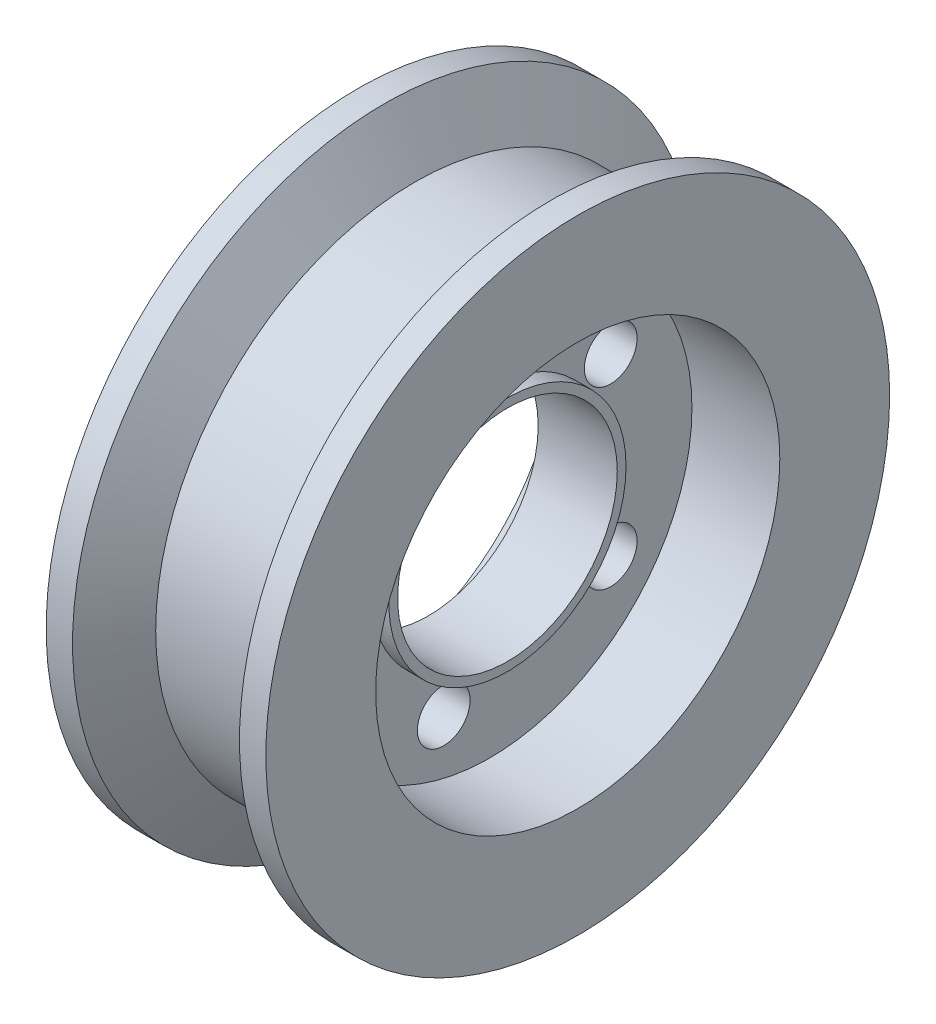
ISO-10303-21;
HEADER;
FILE_DESCRIPTION(('STEP AP214'),'2;1');
FILE_NAME('part.step','',(''),(''),'','','');
FILE_SCHEMA(('AUTOMOTIVE_DESIGN { 1 0 10303 214 1 1 1 1 }'));
ENDSEC;
DATA;
#1=APPLICATION_CONTEXT('core data for automotive mechanical design processes');
#2=APPLICATION_PROTOCOL_DEFINITION('international standard','automotive_design',2000,#1);
#3=PRODUCT_CONTEXT('',#1,'mechanical');
#4=PRODUCT('Part','Part','',(#3));
#5=PRODUCT_RELATED_PRODUCT_CATEGORY('part','',(#4));
#6=PRODUCT_DEFINITION_FORMATION('','',#4);
#7=PRODUCT_DEFINITION_CONTEXT('part definition',#1,'design');
#8=PRODUCT_DEFINITION('design','',#6,#7);
#9=PRODUCT_DEFINITION_SHAPE('','',#8);
#10=(LENGTH_UNIT() NAMED_UNIT(*) SI_UNIT(.MILLI.,.METRE.));
#11=(NAMED_UNIT(*) PLANE_ANGLE_UNIT() SI_UNIT($,.RADIAN.));
#12=(NAMED_UNIT(*) SI_UNIT($,.STERADIAN.) SOLID_ANGLE_UNIT());
#13=UNCERTAINTY_MEASURE_WITH_UNIT(LENGTH_MEASURE(1.E-05),#10,'distance_accuracy_value','');
#14=(GEOMETRIC_REPRESENTATION_CONTEXT(3) GLOBAL_UNCERTAINTY_ASSIGNED_CONTEXT((#13)) GLOBAL_UNIT_ASSIGNED_CONTEXT((#10,
#11,#12)) REPRESENTATION_CONTEXT('',''));
#15=CARTESIAN_POINT('',(0.,0.,0.));
#16=DIRECTION('',(0.,0.,1.));
#17=DIRECTION('',(1.,0.,0.));
#18=AXIS2_PLACEMENT_3D('',#15,#16,#17);
#19=CARTESIAN_POINT('',(12.5,0.,0.));
#20=DIRECTION('',(-1.,0.,0.));
#21=DIRECTION('',(0.,0.,1.));
#22=AXIS2_PLACEMENT_3D('',#19,#20,#21);
#23=CYLINDRICAL_SURFACE('',#22,35.5);
#24=CARTESIAN_POINT('',(-12.5,0.,0.));
#25=DIRECTION('',(1.,0.,0.));
#26=DIRECTION('',(0.,0.,-1.));
#27=AXIS2_PLACEMENT_3D('',#24,#25,#26);
#28=CIRCLE('',#27,35.5);
#29=CARTESIAN_POINT('',(-12.5,0.,-35.5));
#30=VERTEX_POINT('',#29);
#31=EDGE_CURVE('E98',#30,#30,#28,.T.);
#32=ORIENTED_EDGE('',*,*,#31,.T.);
#33=EDGE_LOOP('',(#32));
#34=FACE_BOUND('',#33,.T.);
#35=CARTESIAN_POINT('',(-9.5,0.,0.));
#36=DIRECTION('',(1.,0.,0.));
#37=DIRECTION('',(0.,0.,-1.));
#38=AXIS2_PLACEMENT_3D('',#35,#36,#37);
#39=CIRCLE('',#38,35.5);
#40=CARTESIAN_POINT('',(-9.5,0.,-35.5));
#41=VERTEX_POINT('',#40);
#42=EDGE_CURVE('E164',#41,#41,#39,.T.);
#43=ORIENTED_EDGE('',*,*,#42,.F.);
#44=EDGE_LOOP('',(#43));
#45=FACE_BOUND('',#44,.T.);
#46=ADVANCED_FACE('F43',(#34,#45),#23,.T.);
#47=CARTESIAN_POINT('',(12.5,0.,0.));
#48=DIRECTION('',(1.,0.,0.));
#49=DIRECTION('',(0.,0.,-1.));
#50=AXIS2_PLACEMENT_3D('',#47,#48,#49);
#51=CIRCLE('',#50,35.5);
#52=CARTESIAN_POINT('',(12.5,0.,-35.5));
#53=VERTEX_POINT('',#52);
#54=EDGE_CURVE('E57',#53,#53,#51,.T.);
#55=ORIENTED_EDGE('',*,*,#54,.F.);
#56=EDGE_LOOP('',(#55));
#57=FACE_BOUND('',#56,.T.);
#58=CARTESIAN_POINT('',(9.5,0.,0.));
#59=DIRECTION('',(1.,0.,0.));
#60=DIRECTION('',(0.,0.,-1.));
#61=AXIS2_PLACEMENT_3D('',#58,#59,#60);
#62=CIRCLE('',#61,35.5);
#63=CARTESIAN_POINT('',(9.5,0.,-35.5));
#64=VERTEX_POINT('',#63);
#65=EDGE_CURVE('E242',#64,#64,#62,.T.);
#66=ORIENTED_EDGE('',*,*,#65,.T.);
#67=EDGE_LOOP('',(#66));
#68=FACE_BOUND('',#67,.T.);
#69=ADVANCED_FACE('F161',(#57,#68),#23,.T.);
#70=CARTESIAN_POINT('',(12.5,0.,0.));
#71=DIRECTION('',(1.,0.,0.));
#72=DIRECTION('',(0.,0.,-1.));
#73=AXIS2_PLACEMENT_3D('',#70,#71,#72);
#74=PLANE('',#73);
#75=CARTESIAN_POINT('',(12.5,0.,0.));
#76=DIRECTION('',(1.,0.,0.));
#77=DIRECTION('',(0.,0.,-1.));
#78=AXIS2_PLACEMENT_3D('',#75,#76,#77);
#79=CIRCLE('',#78,23.);
#80=CARTESIAN_POINT('',(12.5,0.,-23.));
#81=VERTEX_POINT('',#80);
#82=EDGE_CURVE('E89',#81,#81,#79,.T.);
#83=ORIENTED_EDGE('',*,*,#82,.F.);
#84=EDGE_LOOP('',(#83));
#85=FACE_BOUND('',#84,.T.);
#86=ORIENTED_EDGE('',*,*,#54,.T.);
#87=EDGE_LOOP('',(#86));
#88=FACE_BOUND('',#87,.T.);
#89=ADVANCED_FACE('F155',(#85,#88),#74,.T.);
#90=CARTESIAN_POINT('',(-12.5,0.,0.));
#91=DIRECTION('',(1.,0.,0.));
#92=DIRECTION('',(0.,0.,-1.));
#93=AXIS2_PLACEMENT_3D('',#90,#91,#92);
#94=PLANE('',#93);
#95=CARTESIAN_POINT('',(-12.5,0.,0.));
#96=DIRECTION('',(1.,0.,0.));
#97=DIRECTION('',(0.,0.,-1.));
#98=AXIS2_PLACEMENT_3D('',#95,#96,#97);
#99=CIRCLE('',#98,23.);
#100=CARTESIAN_POINT('',(-12.5,0.,-23.));
#101=VERTEX_POINT('',#100);
#102=EDGE_CURVE('E90',#101,#101,#99,.T.);
#103=ORIENTED_EDGE('',*,*,#102,.T.);
#104=EDGE_LOOP('',(#103));
#105=FACE_BOUND('',#104,.T.);
#106=ORIENTED_EDGE('',*,*,#31,.F.);
#107=EDGE_LOOP('',(#106));
#108=FACE_BOUND('',#107,.T.);
#109=ADVANCED_FACE('F151',(#105,#108),#94,.F.);
#110=CARTESIAN_POINT('',(2.5,0.,0.));
#111=DIRECTION('',(1.,0.,0.));
#112=DIRECTION('',(0.,0.,-1.));
#113=AXIS2_PLACEMENT_3D('',#110,#111,#112);
#114=CYLINDRICAL_SURFACE('',#113,23.);
#115=CARTESIAN_POINT('',(2.5,0.,0.));
#116=DIRECTION('',(1.,0.,0.));
#117=DIRECTION('',(0.,0.,-1.));
#118=AXIS2_PLACEMENT_3D('',#115,#116,#117);
#119=CIRCLE('',#118,23.);
#120=CARTESIAN_POINT('',(2.5,0.,-23.));
#121=VERTEX_POINT('',#120);
#122=EDGE_CURVE('E94',#121,#121,#119,.T.);
#123=ORIENTED_EDGE('',*,*,#122,.F.);
#124=EDGE_LOOP('',(#123));
#125=FACE_BOUND('',#124,.T.);
#126=ORIENTED_EDGE('',*,*,#82,.T.);
#127=EDGE_LOOP('',(#126));
#128=FACE_BOUND('',#127,.T.);
#129=ADVANCED_FACE('F154',(#125,#128),#114,.F.);
#130=CARTESIAN_POINT('',(2.5,0.,0.));
#131=DIRECTION('',(1.,0.,0.));
#132=DIRECTION('',(0.,0.,-1.));
#133=AXIS2_PLACEMENT_3D('',#130,#131,#132);
#134=PLANE('',#133);
#135=CARTESIAN_POINT('',(2.5,0.,0.));
#136=DIRECTION('',(1.,0.,0.));
#137=DIRECTION('',(0.,0.,-1.));
#138=AXIS2_PLACEMENT_3D('',#135,#136,#137);
#139=CIRCLE('',#138,13.5);
#140=CARTESIAN_POINT('',(2.5,0.,-13.5));
#141=VERTEX_POINT('',#140);
#142=EDGE_CURVE('E10',#141,#141,#139,.T.);
#143=ORIENTED_EDGE('',*,*,#142,.F.);
#144=EDGE_LOOP('',(#143));
#145=FACE_BOUND('',#144,.T.);
#146=CARTESIAN_POINT('',(2.5,16.1679607770176,5.25328890437406));
#147=DIRECTION('',(1.,0.,0.));
#148=DIRECTION('',(0.,-0.951056516295155,-0.309016994374945));
#149=AXIS2_PLACEMENT_3D('',#146,#147,#148);
#150=CIRCLE('',#149,3.);
#151=CARTESIAN_POINT('',(2.5,16.1679607770176,2.25328890437406));
#152=VERTEX_POINT('',#151);
#153=EDGE_CURVE('E62',#152,#152,#150,.T.);
#154=ORIENTED_EDGE('',*,*,#153,.F.);
#155=EDGE_LOOP('',(#154));
#156=FACE_BOUND('',#155,.T.);
#157=CARTESIAN_POINT('',(2.5,9.99234928897197,-13.7532889043742));
#158=DIRECTION('',(1.,0.,0.));
#159=DIRECTION('',(0.,-0.587785252292469,0.809016994374951));
#160=AXIS2_PLACEMENT_3D('',#157,#158,#159);
#161=CIRCLE('',#160,3.);
#162=CARTESIAN_POINT('',(2.5,9.99234928897197,-16.7532889043742));
#163=VERTEX_POINT('',#162);
#164=EDGE_CURVE('E67',#163,#163,#161,.T.);
#165=ORIENTED_EDGE('',*,*,#164,.F.);
#166=EDGE_LOOP('',(#165));
#167=FACE_BOUND('',#166,.T.);
#168=CARTESIAN_POINT('',(2.5,-9.99234928897216,-13.753288904374));
#169=DIRECTION('',(1.,0.,0.));
#170=DIRECTION('',(0.,0.58778525229248,0.809016994374942));
#171=AXIS2_PLACEMENT_3D('',#168,#169,#170);
#172=CIRCLE('',#171,3.);
#173=CARTESIAN_POINT('',(2.5,-9.99234928897216,-16.753288904374));
#174=VERTEX_POINT('',#173);
#175=EDGE_CURVE('E71',#174,#174,#172,.T.);
#176=ORIENTED_EDGE('',*,*,#175,.F.);
#177=EDGE_LOOP('',(#176));
#178=FACE_BOUND('',#177,.T.);
#179=CARTESIAN_POINT('',(2.5,-16.1679607770176,5.25328890437429));
#180=DIRECTION('',(1.,0.,0.));
#181=DIRECTION('',(0.,0.95105651629515,-0.309016994374958));
#182=AXIS2_PLACEMENT_3D('',#179,#180,#181);
#183=CIRCLE('',#182,3.);
#184=CARTESIAN_POINT('',(2.5,-16.1679607770176,2.25328890437429));
#185=VERTEX_POINT('',#184);
#186=EDGE_CURVE('E75',#185,#185,#183,.T.);
#187=ORIENTED_EDGE('',*,*,#186,.F.);
#188=EDGE_LOOP('',(#187));
#189=FACE_BOUND('',#188,.T.);
#190=CARTESIAN_POINT('',(2.5,0.,17.));
#191=DIRECTION('',(1.,0.,0.));
#192=DIRECTION('',(0.,0.,-1.));
#193=AXIS2_PLACEMENT_3D('',#190,#191,#192);
#194=CIRCLE('',#193,3.);
#195=CARTESIAN_POINT('',(2.5,0.,14.));
#196=VERTEX_POINT('',#195);
#197=EDGE_CURVE('E79',#196,#196,#194,.T.);
#198=ORIENTED_EDGE('',*,*,#197,.F.);
#199=EDGE_LOOP('',(#198));
#200=FACE_BOUND('',#199,.T.);
#201=ORIENTED_EDGE('',*,*,#122,.T.);
#202=EDGE_LOOP('',(#201));
#203=FACE_BOUND('',#202,.T.);
#204=ADVANCED_FACE('F147',(#145,#156,#167,#178,#189,#200,#203),#134,.T.);
#205=CARTESIAN_POINT('',(-2.5,0.,0.));
#206=DIRECTION('',(-1.,0.,0.));
#207=DIRECTION('',(0.,0.,1.));
#208=AXIS2_PLACEMENT_3D('',#205,#206,#207);
#209=CYLINDRICAL_SURFACE('',#208,23.);
#210=CARTESIAN_POINT('',(-2.5,0.,0.));
#211=DIRECTION('',(1.,0.,0.));
#212=DIRECTION('',(0.,0.,-1.));
#213=AXIS2_PLACEMENT_3D('',#210,#211,#212);
#214=CIRCLE('',#213,23.);
#215=CARTESIAN_POINT('',(-2.5,0.,-23.));
#216=VERTEX_POINT('',#215);
#217=EDGE_CURVE('E85',#216,#216,#214,.T.);
#218=ORIENTED_EDGE('',*,*,#217,.T.);
#219=EDGE_LOOP('',(#218));
#220=FACE_BOUND('',#219,.T.);
#221=ORIENTED_EDGE('',*,*,#102,.F.);
#222=EDGE_LOOP('',(#221));
#223=FACE_BOUND('',#222,.T.);
#224=ADVANCED_FACE('F132',(#220,#223),#209,.F.);
#225=CARTESIAN_POINT('',(-2.5,0.,0.));
#226=DIRECTION('',(-1.,0.,0.));
#227=DIRECTION('',(0.,0.,-1.));
#228=AXIS2_PLACEMENT_3D('',#225,#226,#227);
#229=PLANE('',#228);
#230=CARTESIAN_POINT('',(-2.5,0.,0.));
#231=DIRECTION('',(-1.,0.,0.));
#232=DIRECTION('',(0.,0.,1.));
#233=AXIS2_PLACEMENT_3D('',#230,#231,#232);
#234=CIRCLE('',#233,13.5);
#235=CARTESIAN_POINT('',(-2.5,0.,13.5));
#236=VERTEX_POINT('',#235);
#237=EDGE_CURVE('E47',#236,#236,#234,.T.);
#238=ORIENTED_EDGE('',*,*,#237,.F.);
#239=EDGE_LOOP('',(#238));
#240=FACE_BOUND('',#239,.T.);
#241=CARTESIAN_POINT('',(-2.5,16.1679607770176,5.25328890437406));
#242=DIRECTION('',(-1.,0.,0.));
#243=DIRECTION('',(0.,0.,1.));
#244=AXIS2_PLACEMENT_3D('',#241,#242,#243);
#245=CIRCLE('',#244,3.);
#246=CARTESIAN_POINT('',(-2.5,16.1679607770176,2.25328890437406));
#247=VERTEX_POINT('',#246);
#248=EDGE_CURVE('E84',#247,#247,#245,.T.);
#249=ORIENTED_EDGE('',*,*,#248,.F.);
#250=EDGE_LOOP('',(#249));
#251=FACE_BOUND('',#250,.T.);
#252=CARTESIAN_POINT('',(-2.5,9.99234928897197,-13.7532889043742));
#253=DIRECTION('',(-1.,0.,0.));
#254=DIRECTION('',(0.,0.,1.));
#255=AXIS2_PLACEMENT_3D('',#252,#253,#254);
#256=CIRCLE('',#255,3.);
#257=CARTESIAN_POINT('',(-2.5,9.99234928897197,-16.7532889043742));
#258=VERTEX_POINT('',#257);
#259=EDGE_CURVE('E118',#258,#258,#256,.T.);
#260=ORIENTED_EDGE('',*,*,#259,.F.);
#261=EDGE_LOOP('',(#260));
#262=FACE_BOUND('',#261,.T.);
#263=CARTESIAN_POINT('',(-2.5,-9.99234928897216,-13.753288904374));
#264=DIRECTION('',(-1.,0.,0.));
#265=DIRECTION('',(0.,0.,1.));
#266=AXIS2_PLACEMENT_3D('',#263,#264,#265);
#267=CIRCLE('',#266,3.);
#268=CARTESIAN_POINT('',(-2.5,-9.99234928897216,-16.753288904374));
#269=VERTEX_POINT('',#268);
#270=EDGE_CURVE('E114',#269,#269,#267,.T.);
#271=ORIENTED_EDGE('',*,*,#270,.F.);
#272=EDGE_LOOP('',(#271));
#273=FACE_BOUND('',#272,.T.);
#274=CARTESIAN_POINT('',(-2.5,-16.1679607770176,5.25328890437429));
#275=DIRECTION('',(-1.,0.,0.));
#276=DIRECTION('',(0.,0.,1.));
#277=AXIS2_PLACEMENT_3D('',#274,#275,#276);
#278=CIRCLE('',#277,3.);
#279=CARTESIAN_POINT('',(-2.5,-16.1679607770176,2.25328890437429));
#280=VERTEX_POINT('',#279);
#281=EDGE_CURVE('E66',#280,#280,#278,.T.);
#282=ORIENTED_EDGE('',*,*,#281,.F.);
#283=EDGE_LOOP('',(#282));
#284=FACE_BOUND('',#283,.T.);
#285=CARTESIAN_POINT('',(-2.5,0.,17.));
#286=DIRECTION('',(-1.,0.,0.));
#287=DIRECTION('',(0.,0.,1.));
#288=AXIS2_PLACEMENT_3D('',#285,#286,#287);
#289=CIRCLE('',#288,3.);
#290=CARTESIAN_POINT('',(-2.5,0.,14.));
#291=VERTEX_POINT('',#290);
#292=EDGE_CURVE('E83',#291,#291,#289,.T.);
#293=ORIENTED_EDGE('',*,*,#292,.F.);
#294=EDGE_LOOP('',(#293));
#295=FACE_BOUND('',#294,.T.);
#296=ORIENTED_EDGE('',*,*,#217,.F.);
#297=EDGE_LOOP('',(#296));
#298=FACE_BOUND('',#297,.T.);
#299=ADVANCED_FACE('F128',(#240,#251,#262,#273,#284,#295,#298),#229,.T.);
#300=CARTESIAN_POINT('',(-12.5,0.,17.));
#301=DIRECTION('',(1.,0.,0.));
#302=DIRECTION('',(0.,0.,-1.));
#303=AXIS2_PLACEMENT_3D('',#300,#301,#302);
#304=CYLINDRICAL_SURFACE('',#303,3.);
#305=CARTESIAN_POINT('',(-2.5,0.,14.));
#306=CARTESIAN_POINT('',(-2.44791666666667,0.,14.));
#307=CARTESIAN_POINT('',(-2.39583333333333,0.,14.));
#308=CARTESIAN_POINT('',(-2.29166666666667,0.,14.));
#309=CARTESIAN_POINT('',(-2.23958333333333,0.,14.));
#310=CARTESIAN_POINT('',(-2.13541666666667,0.,14.));
#311=CARTESIAN_POINT('',(-2.08333333333333,0.,14.));
#312=CARTESIAN_POINT('',(-1.97916666666667,0.,14.));
#313=CARTESIAN_POINT('',(-1.92708333333333,0.,14.));
#314=CARTESIAN_POINT('',(-1.82291666666667,0.,14.));
#315=CARTESIAN_POINT('',(-1.77083333333333,0.,14.));
#316=CARTESIAN_POINT('',(-1.66666666666667,0.,14.));
#317=CARTESIAN_POINT('',(-1.61458333333333,0.,14.));
#318=CARTESIAN_POINT('',(-1.51041666666667,0.,14.));
#319=CARTESIAN_POINT('',(-1.45833333333333,0.,14.));
#320=CARTESIAN_POINT('',(-1.35416666666667,0.,14.));
#321=CARTESIAN_POINT('',(-1.30208333333333,0.,14.));
#322=CARTESIAN_POINT('',(-1.19791666666667,0.,14.));
#323=CARTESIAN_POINT('',(-1.14583333333333,0.,14.));
#324=CARTESIAN_POINT('',(-1.04166666666667,0.,14.));
#325=CARTESIAN_POINT('',(-0.989583333333334,0.,14.));
#326=CARTESIAN_POINT('',(-0.885416666666668,0.,14.));
#327=CARTESIAN_POINT('',(-0.833333333333334,0.,14.));
#328=CARTESIAN_POINT('',(-0.729166666666667,0.,14.));
#329=CARTESIAN_POINT('',(-0.677083333333334,0.,14.));
#330=CARTESIAN_POINT('',(-0.572916666666667,0.,14.));
#331=CARTESIAN_POINT('',(-0.520833333333334,0.,14.));
#332=CARTESIAN_POINT('',(-0.416666666666667,0.,14.));
#333=CARTESIAN_POINT('',(-0.364583333333334,0.,14.));
#334=CARTESIAN_POINT('',(-0.260416666666667,0.,14.));
#335=CARTESIAN_POINT('',(-0.208333333333334,0.,14.));
#336=CARTESIAN_POINT('',(-0.104166666666667,0.,14.));
#337=CARTESIAN_POINT('',(-0.0520833333333334,0.,14.));
#338=CARTESIAN_POINT('',(0.0520833333333334,0.,14.));
#339=CARTESIAN_POINT('',(0.104166666666667,0.,14.));
#340=CARTESIAN_POINT('',(0.208333333333334,0.,14.));
#341=CARTESIAN_POINT('',(0.260416666666667,0.,14.));
#342=CARTESIAN_POINT('',(0.364583333333334,0.,14.));
#343=CARTESIAN_POINT('',(0.416666666666667,0.,14.));
#344=CARTESIAN_POINT('',(0.520833333333334,0.,14.));
#345=CARTESIAN_POINT('',(0.572916666666667,0.,14.));
#346=CARTESIAN_POINT('',(0.677083333333334,0.,14.));
#347=CARTESIAN_POINT('',(0.729166666666667,0.,14.));
#348=CARTESIAN_POINT('',(0.833333333333333,0.,14.));
#349=CARTESIAN_POINT('',(0.885416666666666,0.,14.));
#350=CARTESIAN_POINT('',(0.989583333333333,0.,14.));
#351=CARTESIAN_POINT('',(1.04166666666667,0.,14.));
#352=CARTESIAN_POINT('',(1.14583333333333,0.,14.));
#353=CARTESIAN_POINT('',(1.19791666666667,0.,14.));
#354=CARTESIAN_POINT('',(1.30208333333333,0.,14.));
#355=CARTESIAN_POINT('',(1.35416666666667,0.,14.));
#356=CARTESIAN_POINT('',(1.45833333333333,0.,14.));
#357=CARTESIAN_POINT('',(1.51041666666667,0.,14.));
#358=CARTESIAN_POINT('',(1.61458333333333,0.,14.));
#359=CARTESIAN_POINT('',(1.66666666666667,0.,14.));
#360=CARTESIAN_POINT('',(1.77083333333333,0.,14.));
#361=CARTESIAN_POINT('',(1.82291666666667,0.,14.));
#362=CARTESIAN_POINT('',(1.92708333333333,0.,14.));
#363=CARTESIAN_POINT('',(1.97916666666667,0.,14.));
#364=CARTESIAN_POINT('',(2.08333333333333,0.,14.));
#365=CARTESIAN_POINT('',(2.13541666666667,0.,14.));
#366=CARTESIAN_POINT('',(2.23958333333333,0.,14.));
#367=CARTESIAN_POINT('',(2.29166666666667,0.,14.));
#368=CARTESIAN_POINT('',(2.39583333333333,0.,14.));
#369=CARTESIAN_POINT('',(2.44791666666667,0.,14.));
#370=CARTESIAN_POINT('',(2.5,0.,14.));
#371=B_SPLINE_CURVE_WITH_KNOTS('',3,(#305,#306,#307,#308,#309,#310,#311,#312,#313,#314,#315,
#316,#317,#318,#319,#320,#321,#322,#323,#324,#325,#326,#327,#328,#329,#330,#331,#332,#333,#334,
#335,#336,#337,#338,#339,#340,#341,#342,#343,#344,#345,#346,#347,#348,#349,#350,#351,#352,#353,
#354,#355,#356,#357,#358,#359,#360,#361,#362,#363,#364,#365,#366,#367,#368,#369,#370),
.UNSPECIFIED.,.F.,.F.,(4,2,2,2,2,2,2,2,2,2,2,2,2,2,2,2,2,2,2,2,2,2,2,2,2,2,2,2,2,2,2,2,4),(0.,
0.15625,0.3125,0.46875,0.625000000000001,0.781250000000001,0.937500000000001,1.09375,1.25,
1.40625,1.5625,1.71875,1.875,2.03125,2.1875,2.34375,2.5,2.65625,2.8125,2.96875,3.125,3.28125,
3.4375,3.59375,3.75,3.90625,4.0625,4.21875,4.375,4.53125,4.6875,4.84375,5.),.UNSPECIFIED.);
#372=EDGE_CURVE('BSEAM131',#291,#196,#371,.T.);
#373=ORIENTED_EDGE('',*,*,#292,.T.);
#374=ORIENTED_EDGE('',*,*,#197,.T.);
#375=ORIENTED_EDGE('',*,*,#372,.T.);
#376=ORIENTED_EDGE('',*,*,#372,.F.);
#377=EDGE_LOOP('',(#373,#375,#374,#376));
#378=FACE_BOUND('',#377,.T.);
#379=ADVANCED_FACE('F131',(#378),#304,.F.);
#380=CARTESIAN_POINT('',(-12.5,-16.1679607770176,5.25328890437429));
#381=DIRECTION('',(1.,0.,0.));
#382=DIRECTION('',(0.,0.,-1.));
#383=AXIS2_PLACEMENT_3D('',#380,#381,#382);
#384=CYLINDRICAL_SURFACE('',#383,3.);
#385=CARTESIAN_POINT('',(-2.5,-16.1679607770176,2.25328890437429));
#386=CARTESIAN_POINT('',(-2.44791666666667,-16.1679607770176,2.25328890437429));
#387=CARTESIAN_POINT('',(-2.39583333333333,-16.1679607770176,2.25328890437429));
#388=CARTESIAN_POINT('',(-2.29166666666667,-16.1679607770176,2.25328890437429));
#389=CARTESIAN_POINT('',(-2.23958333333333,-16.1679607770176,2.25328890437429));
#390=CARTESIAN_POINT('',(-2.13541666666667,-16.1679607770176,2.25328890437429));
#391=CARTESIAN_POINT('',(-2.08333333333333,-16.1679607770176,2.25328890437429));
#392=CARTESIAN_POINT('',(-1.97916666666667,-16.1679607770176,2.25328890437429));
#393=CARTESIAN_POINT('',(-1.92708333333333,-16.1679607770176,2.25328890437429));
#394=CARTESIAN_POINT('',(-1.82291666666667,-16.1679607770176,2.25328890437429));
#395=CARTESIAN_POINT('',(-1.77083333333333,-16.1679607770176,2.25328890437429));
#396=CARTESIAN_POINT('',(-1.66666666666667,-16.1679607770176,2.25328890437429));
#397=CARTESIAN_POINT('',(-1.61458333333333,-16.1679607770176,2.25328890437429));
#398=CARTESIAN_POINT('',(-1.51041666666667,-16.1679607770176,2.25328890437429));
#399=CARTESIAN_POINT('',(-1.45833333333333,-16.1679607770176,2.25328890437429));
#400=CARTESIAN_POINT('',(-1.35416666666667,-16.1679607770176,2.25328890437429));
#401=CARTESIAN_POINT('',(-1.30208333333333,-16.1679607770176,2.25328890437429));
#402=CARTESIAN_POINT('',(-1.19791666666667,-16.1679607770176,2.25328890437429));
#403=CARTESIAN_POINT('',(-1.14583333333333,-16.1679607770176,2.25328890437429));
#404=CARTESIAN_POINT('',(-1.04166666666667,-16.1679607770176,2.25328890437429));
#405=CARTESIAN_POINT('',(-0.989583333333334,-16.1679607770176,2.25328890437429));
#406=CARTESIAN_POINT('',(-0.885416666666668,-16.1679607770176,2.25328890437429));
#407=CARTESIAN_POINT('',(-0.833333333333334,-16.1679607770176,2.25328890437429));
#408=CARTESIAN_POINT('',(-0.729166666666667,-16.1679607770176,2.25328890437429));
#409=CARTESIAN_POINT('',(-0.677083333333334,-16.1679607770176,2.25328890437429));
#410=CARTESIAN_POINT('',(-0.572916666666667,-16.1679607770176,2.25328890437429));
#411=CARTESIAN_POINT('',(-0.520833333333334,-16.1679607770176,2.25328890437429));
#412=CARTESIAN_POINT('',(-0.416666666666667,-16.1679607770176,2.25328890437429));
#413=CARTESIAN_POINT('',(-0.364583333333334,-16.1679607770176,2.25328890437429));
#414=CARTESIAN_POINT('',(-0.260416666666667,-16.1679607770176,2.25328890437429));
#415=CARTESIAN_POINT('',(-0.208333333333334,-16.1679607770176,2.25328890437429));
#416=CARTESIAN_POINT('',(-0.104166666666667,-16.1679607770176,2.25328890437429));
#417=CARTESIAN_POINT('',(-0.0520833333333334,-16.1679607770176,2.25328890437429));
#418=CARTESIAN_POINT('',(0.0520833333333334,-16.1679607770176,2.25328890437429));
#419=CARTESIAN_POINT('',(0.104166666666667,-16.1679607770176,2.25328890437429));
#420=CARTESIAN_POINT('',(0.208333333333334,-16.1679607770176,2.25328890437429));
#421=CARTESIAN_POINT('',(0.260416666666667,-16.1679607770176,2.25328890437429));
#422=CARTESIAN_POINT('',(0.364583333333334,-16.1679607770176,2.25328890437429));
#423=CARTESIAN_POINT('',(0.416666666666667,-16.1679607770176,2.25328890437429));
#424=CARTESIAN_POINT('',(0.520833333333334,-16.1679607770176,2.25328890437429));
#425=CARTESIAN_POINT('',(0.572916666666667,-16.1679607770176,2.25328890437429));
#426=CARTESIAN_POINT('',(0.677083333333334,-16.1679607770176,2.25328890437429));
#427=CARTESIAN_POINT('',(0.729166666666667,-16.1679607770176,2.25328890437429));
#428=CARTESIAN_POINT('',(0.833333333333333,-16.1679607770176,2.25328890437429));
#429=CARTESIAN_POINT('',(0.885416666666666,-16.1679607770176,2.25328890437429));
#430=CARTESIAN_POINT('',(0.989583333333333,-16.1679607770176,2.25328890437429));
#431=CARTESIAN_POINT('',(1.04166666666667,-16.1679607770176,2.25328890437429));
#432=CARTESIAN_POINT('',(1.14583333333333,-16.1679607770176,2.25328890437429));
#433=CARTESIAN_POINT('',(1.19791666666667,-16.1679607770176,2.25328890437429));
#434=CARTESIAN_POINT('',(1.30208333333333,-16.1679607770176,2.25328890437429));
#435=CARTESIAN_POINT('',(1.35416666666667,-16.1679607770176,2.25328890437429));
#436=CARTESIAN_POINT('',(1.45833333333333,-16.1679607770176,2.25328890437429));
#437=CARTESIAN_POINT('',(1.51041666666667,-16.1679607770176,2.25328890437429));
#438=CARTESIAN_POINT('',(1.61458333333333,-16.1679607770176,2.25328890437429));
#439=CARTESIAN_POINT('',(1.66666666666667,-16.1679607770176,2.25328890437429));
#440=CARTESIAN_POINT('',(1.77083333333333,-16.1679607770176,2.25328890437429));
#441=CARTESIAN_POINT('',(1.82291666666667,-16.1679607770176,2.25328890437429));
#442=CARTESIAN_POINT('',(1.92708333333333,-16.1679607770176,2.25328890437429));
#443=CARTESIAN_POINT('',(1.97916666666667,-16.1679607770176,2.25328890437429));
#444=CARTESIAN_POINT('',(2.08333333333333,-16.1679607770176,2.25328890437429));
#445=CARTESIAN_POINT('',(2.13541666666667,-16.1679607770176,2.25328890437429));
#446=CARTESIAN_POINT('',(2.23958333333333,-16.1679607770176,2.25328890437429));
#447=CARTESIAN_POINT('',(2.29166666666667,-16.1679607770176,2.25328890437429));
#448=CARTESIAN_POINT('',(2.39583333333333,-16.1679607770176,2.25328890437429));
#449=CARTESIAN_POINT('',(2.44791666666667,-16.1679607770176,2.25328890437429));
#450=CARTESIAN_POINT('',(2.5,-16.1679607770176,2.25328890437429));
#451=B_SPLINE_CURVE_WITH_KNOTS('',3,(#385,#386,#387,#388,#389,#390,#391,#392,#393,#394,#395,
#396,#397,#398,#399,#400,#401,#402,#403,#404,#405,#406,#407,#408,#409,#410,#411,#412,#413,#414,
#415,#416,#417,#418,#419,#420,#421,#422,#423,#424,#425,#426,#427,#428,#429,#430,#431,#432,#433,
#434,#435,#436,#437,#438,#439,#440,#441,#442,#443,#444,#445,#446,#447,#448,#449,#450),
.UNSPECIFIED.,.F.,.F.,(4,2,2,2,2,2,2,2,2,2,2,2,2,2,2,2,2,2,2,2,2,2,2,2,2,2,2,2,2,2,2,2,4),(0.,
0.15625,0.3125,0.46875,0.625000000000001,0.781250000000001,0.937500000000001,1.09375,1.25,
1.40625,1.5625,1.71875,1.875,2.03125,2.1875,2.34375,2.5,2.65625,2.8125,2.96875,3.125,3.28125,
3.4375,3.59375,3.75,3.90625,4.0625,4.21875,4.375,4.53125,4.6875,4.84375,5.),.UNSPECIFIED.);
#452=EDGE_CURVE('BSEAM216',#280,#185,#451,.T.);
#453=ORIENTED_EDGE('',*,*,#281,.T.);
#454=ORIENTED_EDGE('',*,*,#186,.T.);
#455=ORIENTED_EDGE('',*,*,#452,.T.);
#456=ORIENTED_EDGE('',*,*,#452,.F.);
#457=EDGE_LOOP('',(#453,#455,#454,#456));
#458=FACE_BOUND('',#457,.T.);
#459=ADVANCED_FACE('F216',(#458),#384,.F.);
#460=CARTESIAN_POINT('',(-12.5,-9.99234928897216,-13.753288904374));
#461=DIRECTION('',(1.,0.,0.));
#462=DIRECTION('',(0.,0.,-1.));
#463=AXIS2_PLACEMENT_3D('',#460,#461,#462);
#464=CYLINDRICAL_SURFACE('',#463,3.);
#465=CARTESIAN_POINT('',(-2.5,-9.99234928897216,-16.753288904374));
#466=CARTESIAN_POINT('',(-2.44791666666667,-9.99234928897216,-16.753288904374));
#467=CARTESIAN_POINT('',(-2.39583333333333,-9.99234928897216,-16.753288904374));
#468=CARTESIAN_POINT('',(-2.29166666666667,-9.99234928897216,-16.753288904374));
#469=CARTESIAN_POINT('',(-2.23958333333333,-9.99234928897216,-16.753288904374));
#470=CARTESIAN_POINT('',(-2.13541666666667,-9.99234928897216,-16.753288904374));
#471=CARTESIAN_POINT('',(-2.08333333333333,-9.99234928897216,-16.753288904374));
#472=CARTESIAN_POINT('',(-1.97916666666667,-9.99234928897216,-16.753288904374));
#473=CARTESIAN_POINT('',(-1.92708333333333,-9.99234928897216,-16.753288904374));
#474=CARTESIAN_POINT('',(-1.82291666666667,-9.99234928897216,-16.753288904374));
#475=CARTESIAN_POINT('',(-1.77083333333333,-9.99234928897216,-16.753288904374));
#476=CARTESIAN_POINT('',(-1.66666666666667,-9.99234928897216,-16.753288904374));
#477=CARTESIAN_POINT('',(-1.61458333333333,-9.99234928897216,-16.753288904374));
#478=CARTESIAN_POINT('',(-1.51041666666667,-9.99234928897216,-16.753288904374));
#479=CARTESIAN_POINT('',(-1.45833333333333,-9.99234928897216,-16.753288904374));
#480=CARTESIAN_POINT('',(-1.35416666666667,-9.99234928897216,-16.753288904374));
#481=CARTESIAN_POINT('',(-1.30208333333333,-9.99234928897216,-16.753288904374));
#482=CARTESIAN_POINT('',(-1.19791666666667,-9.99234928897216,-16.753288904374));
#483=CARTESIAN_POINT('',(-1.14583333333333,-9.99234928897216,-16.753288904374));
#484=CARTESIAN_POINT('',(-1.04166666666667,-9.99234928897216,-16.753288904374));
#485=CARTESIAN_POINT('',(-0.989583333333334,-9.99234928897216,-16.753288904374));
#486=CARTESIAN_POINT('',(-0.885416666666668,-9.99234928897216,-16.753288904374));
#487=CARTESIAN_POINT('',(-0.833333333333334,-9.99234928897216,-16.753288904374));
#488=CARTESIAN_POINT('',(-0.729166666666667,-9.99234928897216,-16.753288904374));
#489=CARTESIAN_POINT('',(-0.677083333333334,-9.99234928897216,-16.753288904374));
#490=CARTESIAN_POINT('',(-0.572916666666667,-9.99234928897216,-16.753288904374));
#491=CARTESIAN_POINT('',(-0.520833333333334,-9.99234928897216,-16.753288904374));
#492=CARTESIAN_POINT('',(-0.416666666666667,-9.99234928897216,-16.753288904374));
#493=CARTESIAN_POINT('',(-0.364583333333334,-9.99234928897216,-16.753288904374));
#494=CARTESIAN_POINT('',(-0.260416666666667,-9.99234928897216,-16.753288904374));
#495=CARTESIAN_POINT('',(-0.208333333333334,-9.99234928897216,-16.753288904374));
#496=CARTESIAN_POINT('',(-0.104166666666667,-9.99234928897216,-16.753288904374));
#497=CARTESIAN_POINT('',(-0.0520833333333334,-9.99234928897216,-16.753288904374));
#498=CARTESIAN_POINT('',(0.0520833333333334,-9.99234928897216,-16.753288904374));
#499=CARTESIAN_POINT('',(0.104166666666667,-9.99234928897216,-16.753288904374));
#500=CARTESIAN_POINT('',(0.208333333333334,-9.99234928897216,-16.753288904374));
#501=CARTESIAN_POINT('',(0.260416666666667,-9.99234928897216,-16.753288904374));
#502=CARTESIAN_POINT('',(0.364583333333334,-9.99234928897216,-16.753288904374));
#503=CARTESIAN_POINT('',(0.416666666666667,-9.99234928897216,-16.753288904374));
#504=CARTESIAN_POINT('',(0.520833333333334,-9.99234928897216,-16.753288904374));
#505=CARTESIAN_POINT('',(0.572916666666667,-9.99234928897216,-16.753288904374));
#506=CARTESIAN_POINT('',(0.677083333333334,-9.99234928897216,-16.753288904374));
#507=CARTESIAN_POINT('',(0.729166666666667,-9.99234928897216,-16.753288904374));
#508=CARTESIAN_POINT('',(0.833333333333333,-9.99234928897216,-16.753288904374));
#509=CARTESIAN_POINT('',(0.885416666666666,-9.99234928897216,-16.753288904374));
#510=CARTESIAN_POINT('',(0.989583333333333,-9.99234928897216,-16.753288904374));
#511=CARTESIAN_POINT('',(1.04166666666667,-9.99234928897216,-16.753288904374));
#512=CARTESIAN_POINT('',(1.14583333333333,-9.99234928897216,-16.753288904374));
#513=CARTESIAN_POINT('',(1.19791666666667,-9.99234928897216,-16.753288904374));
#514=CARTESIAN_POINT('',(1.30208333333333,-9.99234928897216,-16.753288904374));
#515=CARTESIAN_POINT('',(1.35416666666667,-9.99234928897216,-16.753288904374));
#516=CARTESIAN_POINT('',(1.45833333333333,-9.99234928897216,-16.753288904374));
#517=CARTESIAN_POINT('',(1.51041666666667,-9.99234928897216,-16.753288904374));
#518=CARTESIAN_POINT('',(1.61458333333333,-9.99234928897216,-16.753288904374));
#519=CARTESIAN_POINT('',(1.66666666666667,-9.99234928897216,-16.753288904374));
#520=CARTESIAN_POINT('',(1.77083333333333,-9.99234928897216,-16.753288904374));
#521=CARTESIAN_POINT('',(1.82291666666667,-9.99234928897216,-16.753288904374));
#522=CARTESIAN_POINT('',(1.92708333333333,-9.99234928897216,-16.753288904374));
#523=CARTESIAN_POINT('',(1.97916666666667,-9.99234928897216,-16.753288904374));
#524=CARTESIAN_POINT('',(2.08333333333333,-9.99234928897216,-16.753288904374));
#525=CARTESIAN_POINT('',(2.13541666666667,-9.99234928897216,-16.753288904374));
#526=CARTESIAN_POINT('',(2.23958333333333,-9.99234928897216,-16.753288904374));
#527=CARTESIAN_POINT('',(2.29166666666667,-9.99234928897216,-16.753288904374));
#528=CARTESIAN_POINT('',(2.39583333333333,-9.99234928897216,-16.753288904374));
#529=CARTESIAN_POINT('',(2.44791666666667,-9.99234928897216,-16.753288904374));
#530=CARTESIAN_POINT('',(2.5,-9.99234928897216,-16.753288904374));
#531=B_SPLINE_CURVE_WITH_KNOTS('',3,(#465,#466,#467,#468,#469,#470,#471,#472,#473,#474,#475,
#476,#477,#478,#479,#480,#481,#482,#483,#484,#485,#486,#487,#488,#489,#490,#491,#492,#493,#494,
#495,#496,#497,#498,#499,#500,#501,#502,#503,#504,#505,#506,#507,#508,#509,#510,#511,#512,#513,
#514,#515,#516,#517,#518,#519,#520,#521,#522,#523,#524,#525,#526,#527,#528,#529,#530),
.UNSPECIFIED.,.F.,.F.,(4,2,2,2,2,2,2,2,2,2,2,2,2,2,2,2,2,2,2,2,2,2,2,2,2,2,2,2,2,2,2,2,4),(0.,
0.15625,0.3125,0.46875,0.625000000000001,0.781250000000001,0.937500000000001,1.09375,1.25,
1.40625,1.5625,1.71875,1.875,2.03125,2.1875,2.34375,2.5,2.65625,2.8125,2.96875,3.125,3.28125,
3.4375,3.59375,3.75,3.90625,4.0625,4.21875,4.375,4.53125,4.6875,4.84375,5.),.UNSPECIFIED.);
#532=EDGE_CURVE('BSEAM212',#269,#174,#531,.T.);
#533=ORIENTED_EDGE('',*,*,#270,.T.);
#534=ORIENTED_EDGE('',*,*,#175,.T.);
#535=ORIENTED_EDGE('',*,*,#532,.T.);
#536=ORIENTED_EDGE('',*,*,#532,.F.);
#537=EDGE_LOOP('',(#533,#535,#534,#536));
#538=FACE_BOUND('',#537,.T.);
#539=ADVANCED_FACE('F212',(#538),#464,.F.);
#540=CARTESIAN_POINT('',(-12.5,9.99234928897197,-13.7532889043742));
#541=DIRECTION('',(1.,0.,0.));
#542=DIRECTION('',(0.,0.,-1.));
#543=AXIS2_PLACEMENT_3D('',#540,#541,#542);
#544=CYLINDRICAL_SURFACE('',#543,3.);
#545=CARTESIAN_POINT('',(-2.5,9.99234928897197,-16.7532889043742));
#546=CARTESIAN_POINT('',(-2.44791666666667,9.99234928897197,-16.7532889043742));
#547=CARTESIAN_POINT('',(-2.39583333333333,9.99234928897197,-16.7532889043742));
#548=CARTESIAN_POINT('',(-2.29166666666667,9.99234928897197,-16.7532889043742));
#549=CARTESIAN_POINT('',(-2.23958333333333,9.99234928897197,-16.7532889043742));
#550=CARTESIAN_POINT('',(-2.13541666666667,9.99234928897197,-16.7532889043742));
#551=CARTESIAN_POINT('',(-2.08333333333333,9.99234928897197,-16.7532889043742));
#552=CARTESIAN_POINT('',(-1.97916666666667,9.99234928897197,-16.7532889043742));
#553=CARTESIAN_POINT('',(-1.92708333333333,9.99234928897197,-16.7532889043742));
#554=CARTESIAN_POINT('',(-1.82291666666667,9.99234928897197,-16.7532889043742));
#555=CARTESIAN_POINT('',(-1.77083333333333,9.99234928897197,-16.7532889043742));
#556=CARTESIAN_POINT('',(-1.66666666666667,9.99234928897197,-16.7532889043742));
#557=CARTESIAN_POINT('',(-1.61458333333333,9.99234928897197,-16.7532889043742));
#558=CARTESIAN_POINT('',(-1.51041666666667,9.99234928897197,-16.7532889043742));
#559=CARTESIAN_POINT('',(-1.45833333333333,9.99234928897197,-16.7532889043742));
#560=CARTESIAN_POINT('',(-1.35416666666667,9.99234928897197,-16.7532889043742));
#561=CARTESIAN_POINT('',(-1.30208333333333,9.99234928897197,-16.7532889043742));
#562=CARTESIAN_POINT('',(-1.19791666666667,9.99234928897197,-16.7532889043742));
#563=CARTESIAN_POINT('',(-1.14583333333333,9.99234928897197,-16.7532889043742));
#564=CARTESIAN_POINT('',(-1.04166666666667,9.99234928897197,-16.7532889043742));
#565=CARTESIAN_POINT('',(-0.989583333333334,9.99234928897197,-16.7532889043742));
#566=CARTESIAN_POINT('',(-0.885416666666668,9.99234928897197,-16.7532889043742));
#567=CARTESIAN_POINT('',(-0.833333333333334,9.99234928897197,-16.7532889043742));
#568=CARTESIAN_POINT('',(-0.729166666666667,9.99234928897197,-16.7532889043742));
#569=CARTESIAN_POINT('',(-0.677083333333334,9.99234928897197,-16.7532889043742));
#570=CARTESIAN_POINT('',(-0.572916666666667,9.99234928897197,-16.7532889043742));
#571=CARTESIAN_POINT('',(-0.520833333333334,9.99234928897197,-16.7532889043742));
#572=CARTESIAN_POINT('',(-0.416666666666667,9.99234928897197,-16.7532889043742));
#573=CARTESIAN_POINT('',(-0.364583333333334,9.99234928897197,-16.7532889043742));
#574=CARTESIAN_POINT('',(-0.260416666666667,9.99234928897197,-16.7532889043742));
#575=CARTESIAN_POINT('',(-0.208333333333334,9.99234928897197,-16.7532889043742));
#576=CARTESIAN_POINT('',(-0.104166666666667,9.99234928897197,-16.7532889043742));
#577=CARTESIAN_POINT('',(-0.0520833333333334,9.99234928897197,-16.7532889043742));
#578=CARTESIAN_POINT('',(0.0520833333333334,9.99234928897197,-16.7532889043742));
#579=CARTESIAN_POINT('',(0.104166666666667,9.99234928897197,-16.7532889043742));
#580=CARTESIAN_POINT('',(0.208333333333334,9.99234928897197,-16.7532889043742));
#581=CARTESIAN_POINT('',(0.260416666666667,9.99234928897197,-16.7532889043742));
#582=CARTESIAN_POINT('',(0.364583333333334,9.99234928897197,-16.7532889043742));
#583=CARTESIAN_POINT('',(0.416666666666667,9.99234928897197,-16.7532889043742));
#584=CARTESIAN_POINT('',(0.520833333333334,9.99234928897197,-16.7532889043742));
#585=CARTESIAN_POINT('',(0.572916666666667,9.99234928897197,-16.7532889043742));
#586=CARTESIAN_POINT('',(0.677083333333334,9.99234928897197,-16.7532889043742));
#587=CARTESIAN_POINT('',(0.729166666666667,9.99234928897197,-16.7532889043742));
#588=CARTESIAN_POINT('',(0.833333333333333,9.99234928897197,-16.7532889043742));
#589=CARTESIAN_POINT('',(0.885416666666666,9.99234928897197,-16.7532889043742));
#590=CARTESIAN_POINT('',(0.989583333333333,9.99234928897197,-16.7532889043742));
#591=CARTESIAN_POINT('',(1.04166666666667,9.99234928897197,-16.7532889043742));
#592=CARTESIAN_POINT('',(1.14583333333333,9.99234928897197,-16.7532889043742));
#593=CARTESIAN_POINT('',(1.19791666666667,9.99234928897197,-16.7532889043742));
#594=CARTESIAN_POINT('',(1.30208333333333,9.99234928897197,-16.7532889043742));
#595=CARTESIAN_POINT('',(1.35416666666667,9.99234928897197,-16.7532889043742));
#596=CARTESIAN_POINT('',(1.45833333333333,9.99234928897197,-16.7532889043742));
#597=CARTESIAN_POINT('',(1.51041666666667,9.99234928897197,-16.7532889043742));
#598=CARTESIAN_POINT('',(1.61458333333333,9.99234928897197,-16.7532889043742));
#599=CARTESIAN_POINT('',(1.66666666666667,9.99234928897197,-16.7532889043742));
#600=CARTESIAN_POINT('',(1.77083333333333,9.99234928897197,-16.7532889043742));
#601=CARTESIAN_POINT('',(1.82291666666667,9.99234928897197,-16.7532889043742));
#602=CARTESIAN_POINT('',(1.92708333333333,9.99234928897197,-16.7532889043742));
#603=CARTESIAN_POINT('',(1.97916666666667,9.99234928897197,-16.7532889043742));
#604=CARTESIAN_POINT('',(2.08333333333333,9.99234928897197,-16.7532889043742));
#605=CARTESIAN_POINT('',(2.13541666666667,9.99234928897197,-16.7532889043742));
#606=CARTESIAN_POINT('',(2.23958333333333,9.99234928897197,-16.7532889043742));
#607=CARTESIAN_POINT('',(2.29166666666667,9.99234928897197,-16.7532889043742));
#608=CARTESIAN_POINT('',(2.39583333333333,9.99234928897197,-16.7532889043742));
#609=CARTESIAN_POINT('',(2.44791666666667,9.99234928897197,-16.7532889043742));
#610=CARTESIAN_POINT('',(2.5,9.99234928897197,-16.7532889043742));
#611=B_SPLINE_CURVE_WITH_KNOTS('',3,(#545,#546,#547,#548,#549,#550,#551,#552,#553,#554,#555,
#556,#557,#558,#559,#560,#561,#562,#563,#564,#565,#566,#567,#568,#569,#570,#571,#572,#573,#574,
#575,#576,#577,#578,#579,#580,#581,#582,#583,#584,#585,#586,#587,#588,#589,#590,#591,#592,#593,
#594,#595,#596,#597,#598,#599,#600,#601,#602,#603,#604,#605,#606,#607,#608,#609,#610),
.UNSPECIFIED.,.F.,.F.,(4,2,2,2,2,2,2,2,2,2,2,2,2,2,2,2,2,2,2,2,2,2,2,2,2,2,2,2,2,2,2,2,4),(0.,
0.15625,0.3125,0.46875,0.625000000000001,0.781250000000001,0.937500000000001,1.09375,1.25,
1.40625,1.5625,1.71875,1.875,2.03125,2.1875,2.34375,2.5,2.65625,2.8125,2.96875,3.125,3.28125,
3.4375,3.59375,3.75,3.90625,4.0625,4.21875,4.375,4.53125,4.6875,4.84375,5.),.UNSPECIFIED.);
#612=EDGE_CURVE('BSEAM209',#258,#163,#611,.T.);
#613=ORIENTED_EDGE('',*,*,#259,.T.);
#614=ORIENTED_EDGE('',*,*,#164,.T.);
#615=ORIENTED_EDGE('',*,*,#612,.T.);
#616=ORIENTED_EDGE('',*,*,#612,.F.);
#617=EDGE_LOOP('',(#613,#615,#614,#616));
#618=FACE_BOUND('',#617,.T.);
#619=ADVANCED_FACE('F209',(#618),#544,.F.);
#620=CARTESIAN_POINT('',(-12.5,16.1679607770176,5.25328890437406));
#621=DIRECTION('',(1.,0.,0.));
#622=DIRECTION('',(0.,0.,-1.));
#623=AXIS2_PLACEMENT_3D('',#620,#621,#622);
#624=CYLINDRICAL_SURFACE('',#623,3.);
#625=CARTESIAN_POINT('',(-2.5,16.1679607770176,2.25328890437406));
#626=CARTESIAN_POINT('',(-2.44791666666667,16.1679607770176,2.25328890437406));
#627=CARTESIAN_POINT('',(-2.39583333333333,16.1679607770176,2.25328890437406));
#628=CARTESIAN_POINT('',(-2.29166666666667,16.1679607770176,2.25328890437406));
#629=CARTESIAN_POINT('',(-2.23958333333333,16.1679607770176,2.25328890437406));
#630=CARTESIAN_POINT('',(-2.13541666666667,16.1679607770176,2.25328890437406));
#631=CARTESIAN_POINT('',(-2.08333333333333,16.1679607770176,2.25328890437406));
#632=CARTESIAN_POINT('',(-1.97916666666667,16.1679607770176,2.25328890437406));
#633=CARTESIAN_POINT('',(-1.92708333333333,16.1679607770176,2.25328890437406));
#634=CARTESIAN_POINT('',(-1.82291666666667,16.1679607770176,2.25328890437406));
#635=CARTESIAN_POINT('',(-1.77083333333333,16.1679607770176,2.25328890437406));
#636=CARTESIAN_POINT('',(-1.66666666666667,16.1679607770176,2.25328890437406));
#637=CARTESIAN_POINT('',(-1.61458333333333,16.1679607770176,2.25328890437406));
#638=CARTESIAN_POINT('',(-1.51041666666667,16.1679607770176,2.25328890437406));
#639=CARTESIAN_POINT('',(-1.45833333333333,16.1679607770176,2.25328890437406));
#640=CARTESIAN_POINT('',(-1.35416666666667,16.1679607770176,2.25328890437406));
#641=CARTESIAN_POINT('',(-1.30208333333333,16.1679607770176,2.25328890437406));
#642=CARTESIAN_POINT('',(-1.19791666666667,16.1679607770176,2.25328890437406));
#643=CARTESIAN_POINT('',(-1.14583333333333,16.1679607770176,2.25328890437406));
#644=CARTESIAN_POINT('',(-1.04166666666667,16.1679607770176,2.25328890437406));
#645=CARTESIAN_POINT('',(-0.989583333333334,16.1679607770176,2.25328890437406));
#646=CARTESIAN_POINT('',(-0.885416666666668,16.1679607770176,2.25328890437406));
#647=CARTESIAN_POINT('',(-0.833333333333334,16.1679607770176,2.25328890437406));
#648=CARTESIAN_POINT('',(-0.729166666666667,16.1679607770176,2.25328890437406));
#649=CARTESIAN_POINT('',(-0.677083333333334,16.1679607770176,2.25328890437406));
#650=CARTESIAN_POINT('',(-0.572916666666667,16.1679607770176,2.25328890437406));
#651=CARTESIAN_POINT('',(-0.520833333333334,16.1679607770176,2.25328890437406));
#652=CARTESIAN_POINT('',(-0.416666666666667,16.1679607770176,2.25328890437406));
#653=CARTESIAN_POINT('',(-0.364583333333334,16.1679607770176,2.25328890437406));
#654=CARTESIAN_POINT('',(-0.260416666666667,16.1679607770176,2.25328890437406));
#655=CARTESIAN_POINT('',(-0.208333333333334,16.1679607770176,2.25328890437406));
#656=CARTESIAN_POINT('',(-0.104166666666667,16.1679607770176,2.25328890437406));
#657=CARTESIAN_POINT('',(-0.0520833333333334,16.1679607770176,2.25328890437406));
#658=CARTESIAN_POINT('',(0.0520833333333334,16.1679607770176,2.25328890437406));
#659=CARTESIAN_POINT('',(0.104166666666667,16.1679607770176,2.25328890437406));
#660=CARTESIAN_POINT('',(0.208333333333334,16.1679607770176,2.25328890437406));
#661=CARTESIAN_POINT('',(0.260416666666667,16.1679607770176,2.25328890437406));
#662=CARTESIAN_POINT('',(0.364583333333334,16.1679607770176,2.25328890437406));
#663=CARTESIAN_POINT('',(0.416666666666667,16.1679607770176,2.25328890437406));
#664=CARTESIAN_POINT('',(0.520833333333334,16.1679607770176,2.25328890437406));
#665=CARTESIAN_POINT('',(0.572916666666667,16.1679607770176,2.25328890437406));
#666=CARTESIAN_POINT('',(0.677083333333334,16.1679607770176,2.25328890437406));
#667=CARTESIAN_POINT('',(0.729166666666667,16.1679607770176,2.25328890437406));
#668=CARTESIAN_POINT('',(0.833333333333333,16.1679607770176,2.25328890437406));
#669=CARTESIAN_POINT('',(0.885416666666666,16.1679607770176,2.25328890437406));
#670=CARTESIAN_POINT('',(0.989583333333333,16.1679607770176,2.25328890437406));
#671=CARTESIAN_POINT('',(1.04166666666667,16.1679607770176,2.25328890437406));
#672=CARTESIAN_POINT('',(1.14583333333333,16.1679607770176,2.25328890437406));
#673=CARTESIAN_POINT('',(1.19791666666667,16.1679607770176,2.25328890437406));
#674=CARTESIAN_POINT('',(1.30208333333333,16.1679607770176,2.25328890437406));
#675=CARTESIAN_POINT('',(1.35416666666667,16.1679607770176,2.25328890437406));
#676=CARTESIAN_POINT('',(1.45833333333333,16.1679607770176,2.25328890437406));
#677=CARTESIAN_POINT('',(1.51041666666667,16.1679607770176,2.25328890437406));
#678=CARTESIAN_POINT('',(1.61458333333333,16.1679607770176,2.25328890437406));
#679=CARTESIAN_POINT('',(1.66666666666667,16.1679607770176,2.25328890437406));
#680=CARTESIAN_POINT('',(1.77083333333333,16.1679607770176,2.25328890437406));
#681=CARTESIAN_POINT('',(1.82291666666667,16.1679607770176,2.25328890437406));
#682=CARTESIAN_POINT('',(1.92708333333333,16.1679607770176,2.25328890437406));
#683=CARTESIAN_POINT('',(1.97916666666667,16.1679607770176,2.25328890437406));
#684=CARTESIAN_POINT('',(2.08333333333333,16.1679607770176,2.25328890437406));
#685=CARTESIAN_POINT('',(2.13541666666667,16.1679607770176,2.25328890437406));
#686=CARTESIAN_POINT('',(2.23958333333333,16.1679607770176,2.25328890437406));
#687=CARTESIAN_POINT('',(2.29166666666667,16.1679607770176,2.25328890437406));
#688=CARTESIAN_POINT('',(2.39583333333333,16.1679607770176,2.25328890437406));
#689=CARTESIAN_POINT('',(2.44791666666667,16.1679607770176,2.25328890437406));
#690=CARTESIAN_POINT('',(2.5,16.1679607770176,2.25328890437406));
#691=B_SPLINE_CURVE_WITH_KNOTS('',3,(#625,#626,#627,#628,#629,#630,#631,#632,#633,#634,#635,
#636,#637,#638,#639,#640,#641,#642,#643,#644,#645,#646,#647,#648,#649,#650,#651,#652,#653,#654,
#655,#656,#657,#658,#659,#660,#661,#662,#663,#664,#665,#666,#667,#668,#669,#670,#671,#672,#673,
#674,#675,#676,#677,#678,#679,#680,#681,#682,#683,#684,#685,#686,#687,#688,#689,#690),
.UNSPECIFIED.,.F.,.F.,(4,2,2,2,2,2,2,2,2,2,2,2,2,2,2,2,2,2,2,2,2,2,2,2,2,2,2,2,2,2,2,2,4),(0.,
0.15625,0.3125,0.46875,0.625000000000001,0.781250000000001,0.937500000000001,1.09375,1.25,
1.40625,1.5625,1.71875,1.875,2.03125,2.1875,2.34375,2.5,2.65625,2.8125,2.96875,3.125,3.28125,
3.4375,3.59375,3.75,3.90625,4.0625,4.21875,4.375,4.53125,4.6875,4.84375,5.),.UNSPECIFIED.);
#692=EDGE_CURVE('BSEAM125',#247,#152,#691,.T.);
#693=ORIENTED_EDGE('',*,*,#248,.T.);
#694=ORIENTED_EDGE('',*,*,#153,.T.);
#695=ORIENTED_EDGE('',*,*,#692,.T.);
#696=ORIENTED_EDGE('',*,*,#692,.F.);
#697=EDGE_LOOP('',(#693,#695,#694,#696));
#698=FACE_BOUND('',#697,.T.);
#699=ADVANCED_FACE('F125',(#698),#624,.F.);
#700=CARTESIAN_POINT('',(-4.5,0.,0.));
#701=DIRECTION('',(1.,0.,0.));
#702=DIRECTION('',(0.,0.,-1.));
#703=AXIS2_PLACEMENT_3D('',#700,#701,#702);
#704=CYLINDRICAL_SURFACE('',#703,13.5);
#705=ORIENTED_EDGE('',*,*,#237,.T.);
#706=EDGE_LOOP('',(#705));
#707=FACE_BOUND('',#706,.T.);
#708=CARTESIAN_POINT('',(-4.5,0.,0.));
#709=DIRECTION('',(1.,0.,0.));
#710=DIRECTION('',(0.,0.,-1.));
#711=AXIS2_PLACEMENT_3D('',#708,#709,#710);
#712=CIRCLE('',#711,13.5);
#713=CARTESIAN_POINT('',(-4.5,0.,-13.5));
#714=VERTEX_POINT('',#713);
#715=EDGE_CURVE('E60',#714,#714,#712,.T.);
#716=ORIENTED_EDGE('',*,*,#715,.T.);
#717=EDGE_LOOP('',(#716));
#718=FACE_BOUND('',#717,.T.);
#719=ADVANCED_FACE('F191',(#707,#718),#704,.T.);
#720=CARTESIAN_POINT('',(-4.5,0.,0.));
#721=DIRECTION('',(1.,0.,0.));
#722=DIRECTION('',(0.,0.,-1.));
#723=AXIS2_PLACEMENT_3D('',#720,#721,#722);
#724=PLANE('',#723);
#725=CARTESIAN_POINT('',(-4.5,0.,0.));
#726=DIRECTION('',(1.,0.,0.));
#727=DIRECTION('',(0.,0.,-1.));
#728=AXIS2_PLACEMENT_3D('',#725,#726,#727);
#729=CIRCLE('',#728,12.5);
#730=CARTESIAN_POINT('',(-4.5,0.,-12.5));
#731=VERTEX_POINT('',#730);
#732=EDGE_CURVE('E182',#731,#731,#729,.T.);
#733=ORIENTED_EDGE('',*,*,#732,.T.);
#734=EDGE_LOOP('',(#733));
#735=FACE_BOUND('',#734,.T.);
#736=ORIENTED_EDGE('',*,*,#715,.F.);
#737=EDGE_LOOP('',(#736));
#738=FACE_BOUND('',#737,.T.);
#739=ADVANCED_FACE('F193',(#735,#738),#724,.F.);
#740=ORIENTED_EDGE('',*,*,#142,.T.);
#741=EDGE_LOOP('',(#740));
#742=FACE_BOUND('',#741,.T.);
#743=CARTESIAN_POINT('',(4.5,0.,0.));
#744=DIRECTION('',(1.,0.,0.));
#745=DIRECTION('',(0.,0.,-1.));
#746=AXIS2_PLACEMENT_3D('',#743,#744,#745);
#747=CIRCLE('',#746,13.5);
#748=CARTESIAN_POINT('',(4.5,0.,-13.5));
#749=VERTEX_POINT('',#748);
#750=EDGE_CURVE('E173',#749,#749,#747,.T.);
#751=ORIENTED_EDGE('',*,*,#750,.F.);
#752=EDGE_LOOP('',(#751));
#753=FACE_BOUND('',#752,.T.);
#754=ADVANCED_FACE('F195',(#742,#753),#704,.T.);
#755=CARTESIAN_POINT('',(4.5,0.,0.));
#756=DIRECTION('',(1.,0.,0.));
#757=DIRECTION('',(0.,0.,-1.));
#758=AXIS2_PLACEMENT_3D('',#755,#756,#757);
#759=PLANE('',#758);
#760=ORIENTED_EDGE('',*,*,#750,.T.);
#761=EDGE_LOOP('',(#760));
#762=FACE_BOUND('',#761,.T.);
#763=CARTESIAN_POINT('',(4.5,0.,0.));
#764=DIRECTION('',(1.,0.,0.));
#765=DIRECTION('',(0.,0.,-1.));
#766=AXIS2_PLACEMENT_3D('',#763,#764,#765);
#767=CIRCLE('',#766,12.5);
#768=CARTESIAN_POINT('',(4.5,0.,-12.5));
#769=VERTEX_POINT('',#768);
#770=EDGE_CURVE('E167',#769,#769,#767,.T.);
#771=ORIENTED_EDGE('',*,*,#770,.F.);
#772=EDGE_LOOP('',(#771));
#773=FACE_BOUND('',#772,.T.);
#774=ADVANCED_FACE('F201',(#762,#773),#759,.T.);
#775=CARTESIAN_POINT('',(12.5,0.,0.));
#776=DIRECTION('',(-1.,0.,0.));
#777=DIRECTION('',(0.,0.,1.));
#778=AXIS2_PLACEMENT_3D('',#775,#776,#777);
#779=CYLINDRICAL_SURFACE('',#778,12.5);
#780=ORIENTED_EDGE('',*,*,#732,.F.);
#781=EDGE_LOOP('',(#780));
#782=FACE_BOUND('',#781,.T.);
#783=ORIENTED_EDGE('',*,*,#770,.T.);
#784=EDGE_LOOP('',(#783));
#785=FACE_BOUND('',#784,.T.);
#786=ADVANCED_FACE('F45',(#782,#785),#779,.F.);
#787=CARTESIAN_POINT('',(-6.03589838486221,0.,0.));
#788=DIRECTION('',(-1.,0.,0.));
#789=DIRECTION('',(0.,0.,1.));
#790=AXIS2_PLACEMENT_3D('',#787,#788,#789);
#791=CONICAL_SURFACE('',#790,29.5,1.04719755119659);
#792=ORIENTED_EDGE('',*,*,#42,.T.);
#793=EDGE_LOOP('',(#792));
#794=FACE_BOUND('',#793,.T.);
#795=CARTESIAN_POINT('',(-6.03589838486221,0.,0.));
#796=DIRECTION('',(1.,0.,0.));
#797=DIRECTION('',(0.,0.,-1.));
#798=AXIS2_PLACEMENT_3D('',#795,#796,#797);
#799=CIRCLE('',#798,29.5);
#800=CARTESIAN_POINT('',(-6.03589838486221,0.,-29.5));
#801=VERTEX_POINT('',#800);
#802=EDGE_CURVE('E168',#801,#801,#799,.T.);
#803=ORIENTED_EDGE('',*,*,#802,.F.);
#804=EDGE_LOOP('',(#803));
#805=FACE_BOUND('',#804,.T.);
#806=ADVANCED_FACE('F254',(#794,#805),#791,.T.);
#807=CARTESIAN_POINT('',(0.,0.,0.));
#808=DIRECTION('',(1.,0.,0.));
#809=DIRECTION('',(0.,0.,-1.));
#810=AXIS2_PLACEMENT_3D('',#807,#808,#809);
#811=CYLINDRICAL_SURFACE('',#810,29.5);
#812=ORIENTED_EDGE('',*,*,#802,.T.);
#813=EDGE_LOOP('',(#812));
#814=FACE_BOUND('',#813,.T.);
#815=CARTESIAN_POINT('',(6.03589838486221,0.,0.));
#816=DIRECTION('',(1.,0.,0.));
#817=DIRECTION('',(0.,0.,-1.));
#818=AXIS2_PLACEMENT_3D('',#815,#816,#817);
#819=CIRCLE('',#818,29.5);
#820=CARTESIAN_POINT('',(6.03589838486221,0.,-29.5));
#821=VERTEX_POINT('',#820);
#822=EDGE_CURVE('E176',#821,#821,#819,.T.);
#823=ORIENTED_EDGE('',*,*,#822,.F.);
#824=EDGE_LOOP('',(#823));
#825=FACE_BOUND('',#824,.T.);
#826=ADVANCED_FACE('F252',(#814,#825),#811,.T.);
#827=CARTESIAN_POINT('',(9.5,0.,0.));
#828=DIRECTION('',(1.,0.,0.));
#829=DIRECTION('',(0.,0.,-1.));
#830=AXIS2_PLACEMENT_3D('',#827,#828,#829);
#831=CONICAL_SURFACE('',#830,35.5,1.04719755119659);
#832=ORIENTED_EDGE('',*,*,#822,.T.);
#833=EDGE_LOOP('',(#832));
#834=FACE_BOUND('',#833,.T.);
#835=ORIENTED_EDGE('',*,*,#65,.F.);
#836=EDGE_LOOP('',(#835));
#837=FACE_BOUND('',#836,.T.);
#838=ADVANCED_FACE('F250',(#834,#837),#831,.T.);
#839=CLOSED_SHELL('',(#46,#69,#89,#109,#129,#204,#224,#299,#379,#459,#539,#619,#699,#719,#739,
#754,#774,#786,#806,#826,#838));
#840=MANIFOLD_SOLID_BREP('B2',#839);
#841=ADVANCED_BREP_SHAPE_REPRESENTATION('',(#18,#840),#14);
#842=SHAPE_DEFINITION_REPRESENTATION(#9,#841);
ENDSEC;
END-ISO-10303-21;
